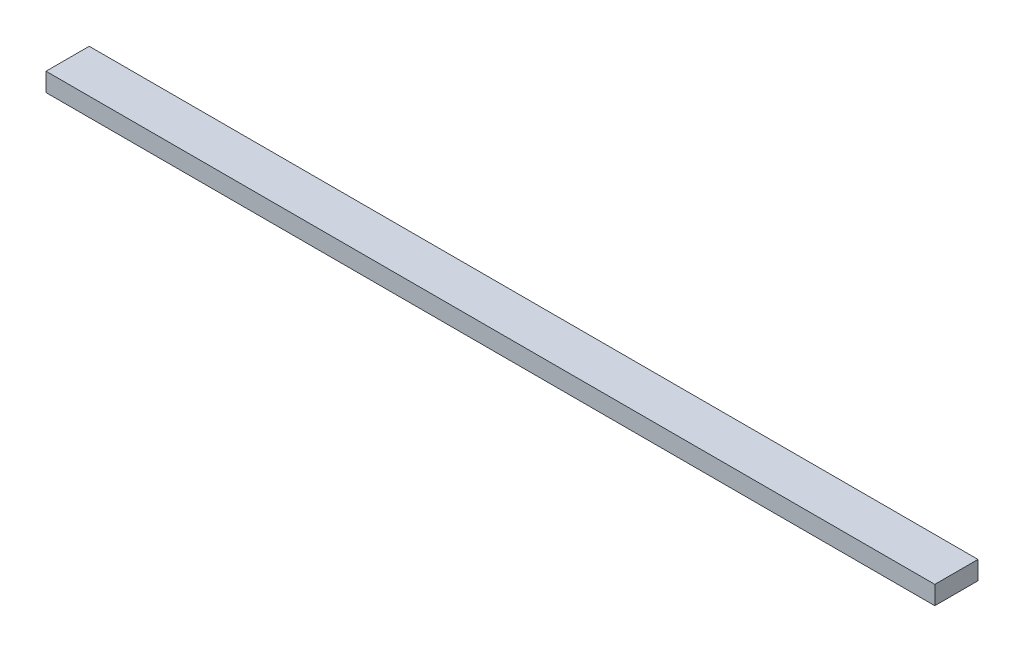
ISO-10303-21;
HEADER;
FILE_DESCRIPTION(('STEP AP214'),'2;1');
FILE_NAME('part.step','',(''),(''),'','','');
FILE_SCHEMA(('AUTOMOTIVE_DESIGN { 1 0 10303 214 1 1 1 1 }'));
ENDSEC;
DATA;
#1=APPLICATION_CONTEXT('core data for automotive mechanical design processes');
#2=APPLICATION_PROTOCOL_DEFINITION('international standard','automotive_design',2000,#1);
#3=PRODUCT_CONTEXT('',#1,'mechanical');
#4=PRODUCT('Part','Part','',(#3));
#5=PRODUCT_RELATED_PRODUCT_CATEGORY('part','',(#4));
#6=PRODUCT_DEFINITION_FORMATION('','',#4);
#7=PRODUCT_DEFINITION_CONTEXT('part definition',#1,'design');
#8=PRODUCT_DEFINITION('design','',#6,#7);
#9=PRODUCT_DEFINITION_SHAPE('','',#8);
#10=(LENGTH_UNIT() NAMED_UNIT(*) SI_UNIT(.MILLI.,.METRE.));
#11=(NAMED_UNIT(*) PLANE_ANGLE_UNIT() SI_UNIT($,.RADIAN.));
#12=(NAMED_UNIT(*) SI_UNIT($,.STERADIAN.) SOLID_ANGLE_UNIT());
#13=UNCERTAINTY_MEASURE_WITH_UNIT(LENGTH_MEASURE(1.E-05),#10,'distance_accuracy_value','');
#14=(GEOMETRIC_REPRESENTATION_CONTEXT(3) GLOBAL_UNCERTAINTY_ASSIGNED_CONTEXT((#13)) GLOBAL_UNIT_ASSIGNED_CONTEXT((#10,
#11,#12)) REPRESENTATION_CONTEXT('',''));
#15=CARTESIAN_POINT('',(0.,0.,0.));
#16=DIRECTION('',(0.,0.,1.));
#17=DIRECTION('',(1.,0.,0.));
#18=AXIS2_PLACEMENT_3D('',#15,#16,#17);
#19=CARTESIAN_POINT('',(0.,-38.1,0.));
#20=DIRECTION('',(-1.,0.,0.));
#21=DIRECTION('',(0.,0.,1.));
#22=AXIS2_PLACEMENT_3D('',#19,#20,#21);
#23=PLANE('',#22);
#24=DIRECTION('',(0.,0.,1.));
#25=VECTOR('',#24,1.);
#26=CARTESIAN_POINT('',(0.,0.,0.));
#27=LINE('',#26,#25);
#28=CARTESIAN_POINT('',(0.,0.,-88.9));
#29=VERTEX_POINT('',#28);
#30=CARTESIAN_POINT('',(0.,0.,0.));
#31=VERTEX_POINT('',#30);
#32=EDGE_CURVE('E112',#29,#31,#27,.T.);
#33=ORIENTED_EDGE('',*,*,#32,.F.);
#34=DIRECTION('',(0.,1.,0.));
#35=VECTOR('',#34,1.);
#36=CARTESIAN_POINT('',(0.,-38.1,-88.9));
#37=LINE('',#36,#35);
#38=CARTESIAN_POINT('',(0.,-38.1,-88.9));
#39=VERTEX_POINT('',#38);
#40=EDGE_CURVE('E11',#39,#29,#37,.T.);
#41=ORIENTED_EDGE('',*,*,#40,.F.);
#42=DIRECTION('',(0.,0.,1.));
#43=VECTOR('',#42,1.);
#44=CARTESIAN_POINT('',(0.,-38.1,0.));
#45=LINE('',#44,#43);
#46=CARTESIAN_POINT('',(0.,-38.1,0.));
#47=VERTEX_POINT('',#46);
#48=EDGE_CURVE('E103',#39,#47,#45,.T.);
#49=ORIENTED_EDGE('',*,*,#48,.T.);
#50=DIRECTION('',(0.,1.,0.));
#51=VECTOR('',#50,1.);
#52=CARTESIAN_POINT('',(0.,-38.1,0.));
#53=LINE('',#52,#51);
#54=EDGE_CURVE('E44',#47,#31,#53,.T.);
#55=ORIENTED_EDGE('',*,*,#54,.T.);
#56=EDGE_LOOP('',(#33,#41,#49,#55));
#57=FACE_BOUND('',#56,.T.);
#58=ADVANCED_FACE('F41',(#57),#23,.T.);
#59=CARTESIAN_POINT('',(0.,-38.1,-88.9));
#60=DIRECTION('',(0.,0.,-1.));
#61=DIRECTION('',(-1.,0.,0.));
#62=AXIS2_PLACEMENT_3D('',#59,#60,#61);
#63=PLANE('',#62);
#64=DIRECTION('',(-1.,0.,0.));
#65=VECTOR('',#64,1.);
#66=CARTESIAN_POINT('',(0.,0.,-88.9));
#67=LINE('',#66,#65);
#68=CARTESIAN_POINT('',(1828.8,0.,-88.9));
#69=VERTEX_POINT('',#68);
#70=EDGE_CURVE('E107',#69,#29,#67,.T.);
#71=ORIENTED_EDGE('',*,*,#70,.F.);
#72=DIRECTION('',(0.,1.,0.));
#73=VECTOR('',#72,1.);
#74=CARTESIAN_POINT('',(1828.8,-38.1,-88.9));
#75=LINE('',#74,#73);
#76=CARTESIAN_POINT('',(1828.8,-38.1,-88.9));
#77=VERTEX_POINT('',#76);
#78=EDGE_CURVE('E51',#77,#69,#75,.T.);
#79=ORIENTED_EDGE('',*,*,#78,.F.);
#80=DIRECTION('',(-1.,0.,0.));
#81=VECTOR('',#80,1.);
#82=CARTESIAN_POINT('',(0.,-38.1,-88.9));
#83=LINE('',#82,#81);
#84=EDGE_CURVE('E98',#77,#39,#83,.T.);
#85=ORIENTED_EDGE('',*,*,#84,.T.);
#86=ORIENTED_EDGE('',*,*,#40,.T.);
#87=EDGE_LOOP('',(#71,#79,#85,#86));
#88=FACE_BOUND('',#87,.T.);
#89=ADVANCED_FACE('F141',(#88),#63,.T.);
#90=CARTESIAN_POINT('',(1828.8,-38.1,-88.9));
#91=DIRECTION('',(1.,0.,0.));
#92=DIRECTION('',(0.,0.,-1.));
#93=AXIS2_PLACEMENT_3D('',#90,#91,#92);
#94=PLANE('',#93);
#95=DIRECTION('',(0.,0.,-1.));
#96=VECTOR('',#95,1.);
#97=CARTESIAN_POINT('',(1828.8,0.,-88.9));
#98=LINE('',#97,#96);
#99=CARTESIAN_POINT('',(1828.8,0.,0.));
#100=VERTEX_POINT('',#99);
#101=EDGE_CURVE('E92',#100,#69,#98,.T.);
#102=ORIENTED_EDGE('',*,*,#101,.F.);
#103=DIRECTION('',(0.,1.,0.));
#104=VECTOR('',#103,1.);
#105=CARTESIAN_POINT('',(1828.8,-38.1,0.));
#106=LINE('',#105,#104);
#107=CARTESIAN_POINT('',(1828.8,-38.1,0.));
#108=VERTEX_POINT('',#107);
#109=EDGE_CURVE('E87',#108,#100,#106,.T.);
#110=ORIENTED_EDGE('',*,*,#109,.F.);
#111=DIRECTION('',(0.,0.,-1.));
#112=VECTOR('',#111,1.);
#113=CARTESIAN_POINT('',(1828.8,-38.1,-88.9));
#114=LINE('',#113,#112);
#115=EDGE_CURVE('E90',#108,#77,#114,.T.);
#116=ORIENTED_EDGE('',*,*,#115,.T.);
#117=ORIENTED_EDGE('',*,*,#78,.T.);
#118=EDGE_LOOP('',(#102,#110,#116,#117));
#119=FACE_BOUND('',#118,.T.);
#120=ADVANCED_FACE('F89',(#119),#94,.T.);
#121=CARTESIAN_POINT('',(0.,-38.1,0.));
#122=DIRECTION('',(0.,0.,1.));
#123=DIRECTION('',(1.,0.,0.));
#124=AXIS2_PLACEMENT_3D('',#121,#122,#123);
#125=PLANE('',#124);
#126=DIRECTION('',(1.,0.,0.));
#127=VECTOR('',#126,1.);
#128=CARTESIAN_POINT('',(0.,0.,0.));
#129=LINE('',#128,#127);
#130=EDGE_CURVE('E116',#31,#100,#129,.T.);
#131=ORIENTED_EDGE('',*,*,#130,.F.);
#132=ORIENTED_EDGE('',*,*,#54,.F.);
#133=DIRECTION('',(1.,0.,0.));
#134=VECTOR('',#133,1.);
#135=CARTESIAN_POINT('',(0.,-38.1,0.));
#136=LINE('',#135,#134);
#137=EDGE_CURVE('E97',#47,#108,#136,.T.);
#138=ORIENTED_EDGE('',*,*,#137,.T.);
#139=ORIENTED_EDGE('',*,*,#109,.T.);
#140=EDGE_LOOP('',(#131,#132,#138,#139));
#141=FACE_BOUND('',#140,.T.);
#142=ADVANCED_FACE('F101',(#141),#125,.T.);
#143=CARTESIAN_POINT('',(0.,-38.1,0.));
#144=DIRECTION('',(0.,-1.,0.));
#145=DIRECTION('',(0.,0.,-1.));
#146=AXIS2_PLACEMENT_3D('',#143,#144,#145);
#147=PLANE('',#146);
#148=ORIENTED_EDGE('',*,*,#48,.F.);
#149=ORIENTED_EDGE('',*,*,#84,.F.);
#150=ORIENTED_EDGE('',*,*,#115,.F.);
#151=ORIENTED_EDGE('',*,*,#137,.F.);
#152=EDGE_LOOP('',(#148,#149,#150,#151));
#153=FACE_BOUND('',#152,.T.);
#154=ADVANCED_FACE('F96',(#153),#147,.T.);
#155=CARTESIAN_POINT('',(0.,0.,0.));
#156=DIRECTION('',(0.,-1.,0.));
#157=DIRECTION('',(0.,0.,-1.));
#158=AXIS2_PLACEMENT_3D('',#155,#156,#157);
#159=PLANE('',#158);
#160=ORIENTED_EDGE('',*,*,#32,.T.);
#161=ORIENTED_EDGE('',*,*,#130,.T.);
#162=ORIENTED_EDGE('',*,*,#101,.T.);
#163=ORIENTED_EDGE('',*,*,#70,.T.);
#164=EDGE_LOOP('',(#160,#161,#162,#163));
#165=FACE_BOUND('',#164,.T.);
#166=ADVANCED_FACE('F140',(#165),#159,.F.);
#167=CLOSED_SHELL('',(#58,#89,#120,#142,#154,#166));
#168=MANIFOLD_SOLID_BREP('B2',#167);
#169=ADVANCED_BREP_SHAPE_REPRESENTATION('',(#18,#168),#14);
#170=SHAPE_DEFINITION_REPRESENTATION(#9,#169);
ENDSEC;
END-ISO-10303-21;
